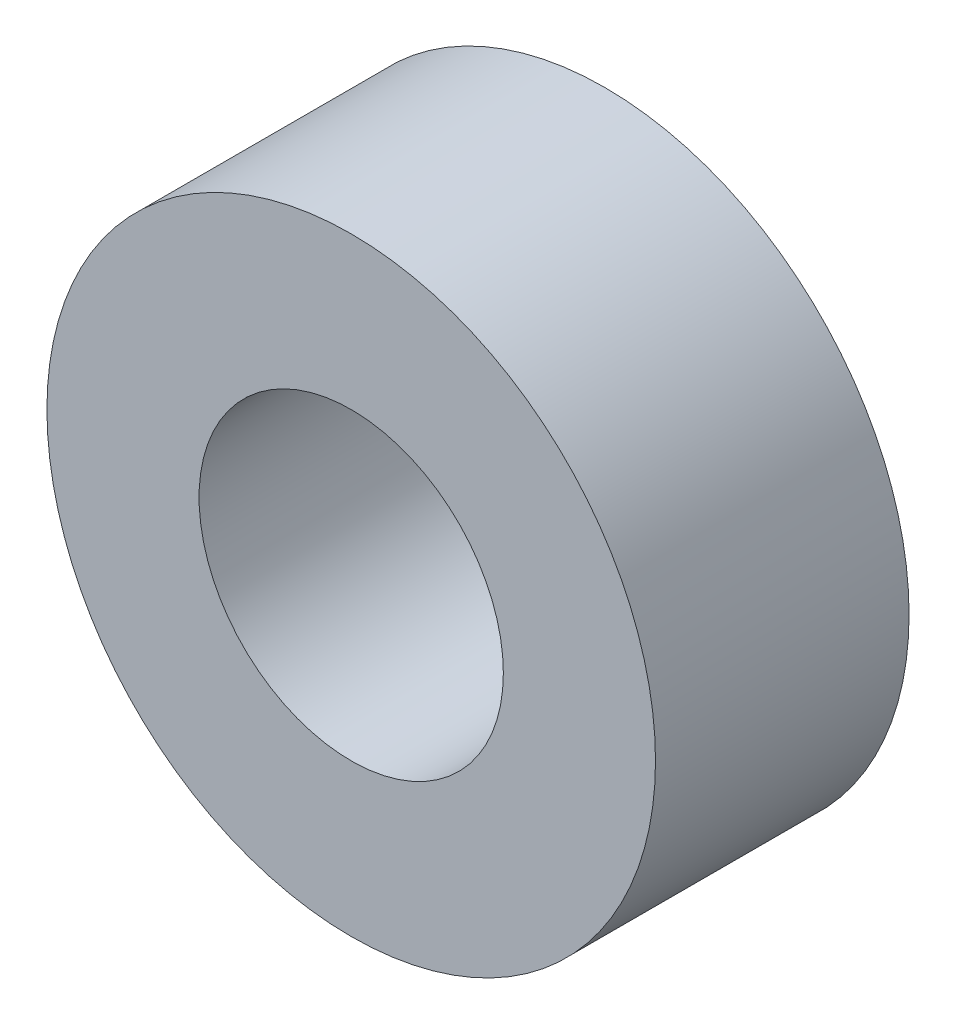
ISO-10303-21;
HEADER;
FILE_DESCRIPTION(('STEP AP214'),'2;1');
FILE_NAME('part.step','',(''),(''),'','','');
FILE_SCHEMA(('AUTOMOTIVE_DESIGN { 1 0 10303 214 1 1 1 1 }'));
ENDSEC;
DATA;
#1=APPLICATION_CONTEXT('core data for automotive mechanical design processes');
#2=APPLICATION_PROTOCOL_DEFINITION('international standard','automotive_design',2000,#1);
#3=PRODUCT_CONTEXT('',#1,'mechanical');
#4=PRODUCT('Part','Part','',(#3));
#5=PRODUCT_RELATED_PRODUCT_CATEGORY('part','',(#4));
#6=PRODUCT_DEFINITION_FORMATION('','',#4);
#7=PRODUCT_DEFINITION_CONTEXT('part definition',#1,'design');
#8=PRODUCT_DEFINITION('design','',#6,#7);
#9=PRODUCT_DEFINITION_SHAPE('','',#8);
#10=(LENGTH_UNIT() NAMED_UNIT(*) SI_UNIT(.MILLI.,.METRE.));
#11=(NAMED_UNIT(*) PLANE_ANGLE_UNIT() SI_UNIT($,.RADIAN.));
#12=(NAMED_UNIT(*) SI_UNIT($,.STERADIAN.) SOLID_ANGLE_UNIT());
#13=UNCERTAINTY_MEASURE_WITH_UNIT(LENGTH_MEASURE(1.E-05),#10,'distance_accuracy_value','');
#14=(GEOMETRIC_REPRESENTATION_CONTEXT(3) GLOBAL_UNCERTAINTY_ASSIGNED_CONTEXT((#13)) GLOBAL_UNIT_ASSIGNED_CONTEXT((#10,
#11,#12)) REPRESENTATION_CONTEXT('',''));
#15=CARTESIAN_POINT('',(0.,0.,0.));
#16=DIRECTION('',(0.,0.,1.));
#17=DIRECTION('',(1.,0.,0.));
#18=AXIS2_PLACEMENT_3D('',#15,#16,#17);
#19=CARTESIAN_POINT('',(0.,0.,-2.5));
#20=DIRECTION('',(0.,0.,1.));
#21=DIRECTION('',(1.,0.,0.));
#22=AXIS2_PLACEMENT_3D('',#19,#20,#21);
#23=CYLINDRICAL_SURFACE('',#22,3.);
#24=CARTESIAN_POINT('',(0.,0.,-2.5));
#25=DIRECTION('',(0.,0.,1.));
#26=DIRECTION('',(1.,0.,0.));
#27=AXIS2_PLACEMENT_3D('',#24,#25,#26);
#28=CIRCLE('',#27,3.);
#29=CARTESIAN_POINT('',(3.,0.,-2.5));
#30=VERTEX_POINT('',#29);
#31=EDGE_CURVE('E10',#30,#30,#28,.T.);
#32=ORIENTED_EDGE('',*,*,#31,.T.);
#33=EDGE_LOOP('',(#32));
#34=FACE_BOUND('',#33,.T.);
#35=CARTESIAN_POINT('',(0.,0.,0.));
#36=DIRECTION('',(0.,0.,1.));
#37=DIRECTION('',(1.,0.,0.));
#38=AXIS2_PLACEMENT_3D('',#35,#36,#37);
#39=CIRCLE('',#38,3.);
#40=CARTESIAN_POINT('',(3.,0.,0.));
#41=VERTEX_POINT('',#40);
#42=EDGE_CURVE('E40',#41,#41,#39,.T.);
#43=ORIENTED_EDGE('',*,*,#42,.F.);
#44=EDGE_LOOP('',(#43));
#45=FACE_BOUND('',#44,.T.);
#46=ADVANCED_FACE('F37',(#34,#45),#23,.T.);
#47=CARTESIAN_POINT('',(0.,0.,-2.5));
#48=DIRECTION('',(0.,0.,1.));
#49=DIRECTION('',(1.,0.,0.));
#50=AXIS2_PLACEMENT_3D('',#47,#48,#49);
#51=PLANE('',#50);
#52=CARTESIAN_POINT('',(0.,0.,-2.5));
#53=DIRECTION('',(0.,0.,1.));
#54=DIRECTION('',(1.,0.,0.));
#55=AXIS2_PLACEMENT_3D('',#52,#53,#54);
#56=CIRCLE('',#55,1.5);
#57=CARTESIAN_POINT('',(1.5,0.,-2.5));
#58=VERTEX_POINT('',#57);
#59=EDGE_CURVE('E49',#58,#58,#56,.T.);
#60=ORIENTED_EDGE('',*,*,#59,.T.);
#61=EDGE_LOOP('',(#60));
#62=FACE_BOUND('',#61,.T.);
#63=ORIENTED_EDGE('',*,*,#31,.F.);
#64=EDGE_LOOP('',(#63));
#65=FACE_BOUND('',#64,.T.);
#66=ADVANCED_FACE('F59',(#62,#65),#51,.F.);
#67=CARTESIAN_POINT('',(0.,0.,0.));
#68=DIRECTION('',(0.,0.,1.));
#69=DIRECTION('',(1.,0.,0.));
#70=AXIS2_PLACEMENT_3D('',#67,#68,#69);
#71=PLANE('',#70);
#72=CARTESIAN_POINT('',(0.,0.,0.));
#73=DIRECTION('',(0.,0.,1.));
#74=DIRECTION('',(1.,0.,0.));
#75=AXIS2_PLACEMENT_3D('',#72,#73,#74);
#76=CIRCLE('',#75,1.5);
#77=CARTESIAN_POINT('',(1.5,0.,0.));
#78=VERTEX_POINT('',#77);
#79=EDGE_CURVE('E51',#78,#78,#76,.T.);
#80=ORIENTED_EDGE('',*,*,#79,.F.);
#81=EDGE_LOOP('',(#80));
#82=FACE_BOUND('',#81,.T.);
#83=ORIENTED_EDGE('',*,*,#42,.T.);
#84=EDGE_LOOP('',(#83));
#85=FACE_BOUND('',#84,.T.);
#86=ADVANCED_FACE('F65',(#82,#85),#71,.T.);
#87=CARTESIAN_POINT('',(0.,0.,-2.5));
#88=DIRECTION('',(0.,0.,1.));
#89=DIRECTION('',(1.,0.,0.));
#90=AXIS2_PLACEMENT_3D('',#87,#88,#89);
#91=CYLINDRICAL_SURFACE('',#90,1.5);
#92=ORIENTED_EDGE('',*,*,#59,.F.);
#93=EDGE_LOOP('',(#92));
#94=FACE_BOUND('',#93,.T.);
#95=ORIENTED_EDGE('',*,*,#79,.T.);
#96=EDGE_LOOP('',(#95));
#97=FACE_BOUND('',#96,.T.);
#98=ADVANCED_FACE('F62',(#94,#97),#91,.F.);
#99=CLOSED_SHELL('',(#46,#66,#86,#98));
#100=MANIFOLD_SOLID_BREP('B2',#99);
#101=ADVANCED_BREP_SHAPE_REPRESENTATION('',(#18,#100),#14);
#102=SHAPE_DEFINITION_REPRESENTATION(#9,#101);
ENDSEC;
END-ISO-10303-21;
